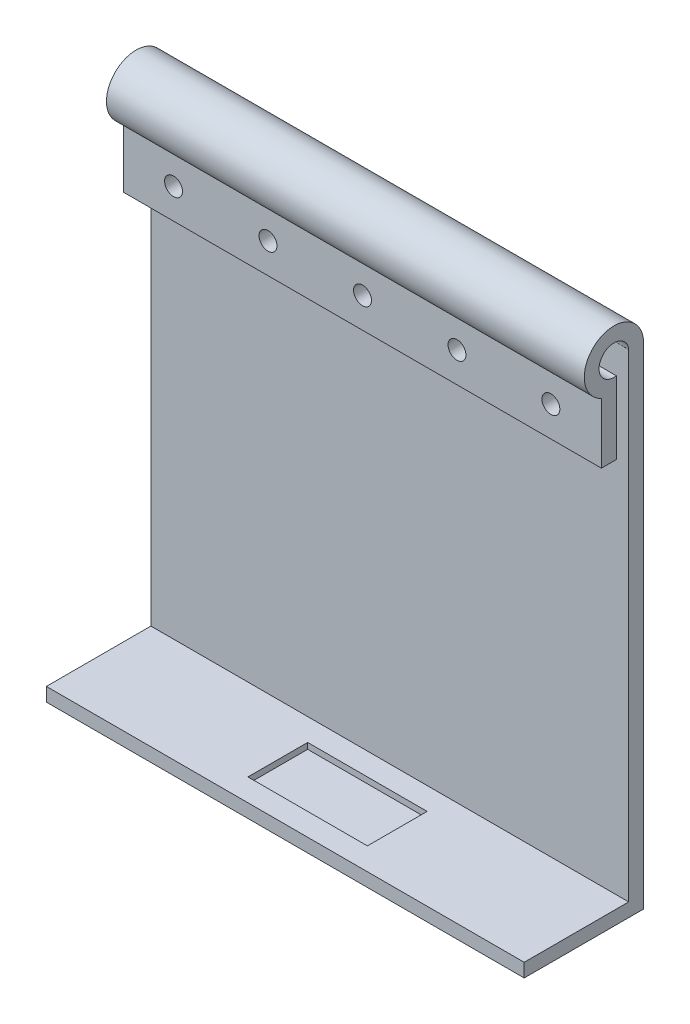
ISO-10303-21;
HEADER;
FILE_DESCRIPTION(('STEP AP214'),'2;1');
FILE_NAME('part.step','',(''),(''),'','','');
FILE_SCHEMA(('AUTOMOTIVE_DESIGN { 1 0 10303 214 1 1 1 1 }'));
ENDSEC;
DATA;
#1=APPLICATION_CONTEXT('core data for automotive mechanical design processes');
#2=APPLICATION_PROTOCOL_DEFINITION('international standard','automotive_design',2000,#1);
#3=PRODUCT_CONTEXT('',#1,'mechanical');
#4=PRODUCT('Part','Part','',(#3));
#5=PRODUCT_RELATED_PRODUCT_CATEGORY('part','',(#4));
#6=PRODUCT_DEFINITION_FORMATION('','',#4);
#7=PRODUCT_DEFINITION_CONTEXT('part definition',#1,'design');
#8=PRODUCT_DEFINITION('design','',#6,#7);
#9=PRODUCT_DEFINITION_SHAPE('','',#8);
#10=(LENGTH_UNIT() NAMED_UNIT(*) SI_UNIT(.MILLI.,.METRE.));
#11=(NAMED_UNIT(*) PLANE_ANGLE_UNIT() SI_UNIT($,.RADIAN.));
#12=(NAMED_UNIT(*) SI_UNIT($,.STERADIAN.) SOLID_ANGLE_UNIT());
#13=UNCERTAINTY_MEASURE_WITH_UNIT(LENGTH_MEASURE(1.E-05),#10,'distance_accuracy_value','');
#14=(GEOMETRIC_REPRESENTATION_CONTEXT(3) GLOBAL_UNCERTAINTY_ASSIGNED_CONTEXT((#13)) GLOBAL_UNIT_ASSIGNED_CONTEXT((#10,
#11,#12)) REPRESENTATION_CONTEXT('',''));
#15=CARTESIAN_POINT('',(0.,0.,0.));
#16=DIRECTION('',(0.,0.,1.));
#17=DIRECTION('',(1.,0.,0.));
#18=AXIS2_PLACEMENT_3D('',#15,#16,#17);
#19=CARTESIAN_POINT('',(0.,101.718969555035,3.175));
#20=DIRECTION('',(1.,0.,0.));
#21=DIRECTION('',(0.,0.,-1.));
#22=AXIS2_PLACEMENT_3D('',#19,#20,#21);
#23=PLANE('',#22);
#24=CARTESIAN_POINT('',(0.,101.334380732119,6.30719026611726));
#25=DIRECTION('',(1.,0.,0.));
#26=DIRECTION('',(0.,0.,-1.));
#27=AXIS2_PLACEMENT_3D('',#24,#25,#26);
#28=CIRCLE('',#27,3.175);
#29=CARTESIAN_POINT('',(0.,101.718969555035,3.15556902661396));
#30=VERTEX_POINT('',#29);
#31=CARTESIAN_POINT('',(0.,98.1999292876698,5.80138482685519));
#32=VERTEX_POINT('',#31);
#33=EDGE_CURVE('E345',#30,#32,#28,.T.);
#34=ORIENTED_EDGE('',*,*,#33,.T.);
#35=DIRECTION('',(0.,1.,0.));
#36=VECTOR('',#35,1.);
#37=CARTESIAN_POINT('',(0.,0.,5.80138482685519));
#38=LINE('',#37,#36);
#39=CARTESIAN_POINT('',(0.,82.7748742326806,5.80138482685519));
#40=VERTEX_POINT('',#39);
#41=EDGE_CURVE('E361',#40,#32,#38,.T.);
#42=ORIENTED_EDGE('',*,*,#41,.F.);
#43=DIRECTION('',(0.,0.,-1.));
#44=VECTOR('',#43,1.);
#45=CARTESIAN_POINT('',(0.,82.7748742326806,0.));
#46=LINE('',#45,#44);
#47=CARTESIAN_POINT('',(0.,82.7748742326806,8.97638482685518));
#48=VERTEX_POINT('',#47);
#49=EDGE_CURVE('E357',#48,#40,#46,.T.);
#50=ORIENTED_EDGE('',*,*,#49,.F.);
#51=DIRECTION('',(0.,-1.,0.));
#52=VECTOR('',#51,1.);
#53=CARTESIAN_POINT('',(0.,0.,8.97638482685518));
#54=LINE('',#53,#52);
#55=CARTESIAN_POINT('',(0.,95.6129273337618,8.97638482685518));
#56=VERTEX_POINT('',#55);
#57=EDGE_CURVE('E353',#56,#48,#54,.T.);
#58=ORIENTED_EDGE('',*,*,#57,.F.);
#59=CARTESIAN_POINT('',(0.,101.334380732119,6.30719026611726));
#60=DIRECTION('',(1.,0.,0.));
#61=DIRECTION('',(0.,0.,-1.));
#62=AXIS2_PLACEMENT_3D('',#59,#60,#61);
#63=CIRCLE('',#62,6.313448233149);
#64=CARTESIAN_POINT('',(0.,101.718969555035,0.00546668998822365));
#65=VERTEX_POINT('',#64);
#66=EDGE_CURVE('E349',#65,#56,#63,.T.);
#67=ORIENTED_EDGE('',*,*,#66,.F.);
#68=DIRECTION('',(0.,0.,-1.));
#69=VECTOR('',#68,1.);
#70=CARTESIAN_POINT('',(0.,101.718969555035,3.175));
#71=LINE('',#70,#69);
#72=CARTESIAN_POINT('',(0.,101.718969555035,0.));
#73=VERTEX_POINT('',#72);
#74=EDGE_CURVE('E446',#65,#73,#71,.T.);
#75=ORIENTED_EDGE('',*,*,#74,.T.);
#76=DIRECTION('',(0.,-1.,0.));
#77=VECTOR('',#76,1.);
#78=CARTESIAN_POINT('',(0.,101.718969555035,0.));
#79=LINE('',#78,#77);
#80=CARTESIAN_POINT('',(0.,101.615413718881,0.));
#81=VERTEX_POINT('',#80);
#82=EDGE_CURVE('E452',#73,#81,#79,.T.);
#83=ORIENTED_EDGE('',*,*,#82,.T.);
#84=CARTESIAN_POINT('',(0.,101.615413718881,0.));
#85=DIRECTION('',(0.,-1.,0.));
#86=VECTOR('',#85,1.);
#87=LINE('',#84,#86);
#88=CARTESIAN_POINT('',(0.,101.053347745358,0.));
#89=VERTEX_POINT('',#88);
#90=EDGE_CURVE('E457',#81,#89,#87,.T.);
#91=ORIENTED_EDGE('',*,*,#90,.T.);
#92=CARTESIAN_POINT('',(0.,-2.8971260585032,0.));
#93=VERTEX_POINT('',#92);
#94=EDGE_CURVE('E51',#89,#93,#79,.T.);
#95=ORIENTED_EDGE('',*,*,#94,.T.);
#96=DIRECTION('',(0.,0.,1.));
#97=VECTOR('',#96,1.);
#98=CARTESIAN_POINT('',(0.,-2.8971260585032,0.));
#99=LINE('',#98,#97);
#100=CARTESIAN_POINT('',(0.,-2.8971260585032,25.4));
#101=VERTEX_POINT('',#100);
#102=EDGE_CURVE('E244',#93,#101,#99,.T.);
#103=ORIENTED_EDGE('',*,*,#102,.T.);
#104=DIRECTION('',(0.,1.,0.));
#105=VECTOR('',#104,1.);
#106=CARTESIAN_POINT('',(0.,-2.8971260585032,25.4));
#107=LINE('',#106,#105);
#108=CARTESIAN_POINT('',(0.,0.,25.4));
#109=VERTEX_POINT('',#108);
#110=EDGE_CURVE('E232',#101,#109,#107,.T.);
#111=ORIENTED_EDGE('',*,*,#110,.T.);
#112=DIRECTION('',(0.,0.,-1.));
#113=VECTOR('',#112,1.);
#114=CARTESIAN_POINT('',(0.,0.,25.4));
#115=LINE('',#114,#113);
#116=CARTESIAN_POINT('',(0.,0.,3.175));
#117=VERTEX_POINT('',#116);
#118=EDGE_CURVE('E222',#109,#117,#115,.T.);
#119=ORIENTED_EDGE('',*,*,#118,.T.);
#120=DIRECTION('',(0.,-1.,0.));
#121=VECTOR('',#120,1.);
#122=CARTESIAN_POINT('',(0.,101.718969555035,3.175));
#123=LINE('',#122,#121);
#124=CARTESIAN_POINT('',(0.,101.718969555035,3.175));
#125=VERTEX_POINT('',#124);
#126=EDGE_CURVE('E427',#125,#117,#123,.T.);
#127=ORIENTED_EDGE('',*,*,#126,.F.);
#128=EDGE_CURVE('E524',#125,#30,#71,.T.);
#129=ORIENTED_EDGE('',*,*,#128,.T.);
#130=EDGE_LOOP('',(#34,#42,#50,#58,#67,#75,#83,#91,#95,#103,#111,#119,#127,#129));
#131=FACE_BOUND('',#130,.T.);
#132=ADVANCED_FACE('F47',(#131),#23,.F.);
#133=CARTESIAN_POINT('',(101.6,0.,3.175));
#134=DIRECTION('',(-1.,0.,0.));
#135=DIRECTION('',(0.,0.,1.));
#136=AXIS2_PLACEMENT_3D('',#133,#134,#135);
#137=PLANE('',#136);
#138=DIRECTION('',(0.,1.,0.));
#139=VECTOR('',#138,1.);
#140=CARTESIAN_POINT('',(101.6,0.,5.80138482685519));
#141=LINE('',#140,#139);
#142=CARTESIAN_POINT('',(101.6,82.7748742326806,5.80138482685519));
#143=VERTEX_POINT('',#142);
#144=CARTESIAN_POINT('',(101.6,98.1999292876698,5.80138482685519));
#145=VERTEX_POINT('',#144);
#146=EDGE_CURVE('E350',#143,#145,#141,.T.);
#147=ORIENTED_EDGE('',*,*,#146,.T.);
#148=CARTESIAN_POINT('',(101.6,101.334380732119,6.30719026611726));
#149=DIRECTION('',(1.,0.,0.));
#150=DIRECTION('',(0.,0.,-1.));
#151=AXIS2_PLACEMENT_3D('',#148,#149,#150);
#152=CIRCLE('',#151,3.175);
#153=CARTESIAN_POINT('',(101.6,101.718969555035,3.15556902661396));
#154=VERTEX_POINT('',#153);
#155=EDGE_CURVE('E344',#154,#145,#152,.T.);
#156=ORIENTED_EDGE('',*,*,#155,.F.);
#157=DIRECTION('',(0.,0.,-1.));
#158=VECTOR('',#157,1.);
#159=CARTESIAN_POINT('',(101.6,101.718969555035,3.175));
#160=LINE('',#159,#158);
#161=CARTESIAN_POINT('',(101.6,101.718969555035,3.175));
#162=VERTEX_POINT('',#161);
#163=EDGE_CURVE('E74',#162,#154,#160,.T.);
#164=ORIENTED_EDGE('',*,*,#163,.F.);
#165=DIRECTION('',(0.,1.,0.));
#166=VECTOR('',#165,1.);
#167=CARTESIAN_POINT('',(101.6,0.,3.175));
#168=LINE('',#167,#166);
#169=CARTESIAN_POINT('',(101.6,0.,3.175));
#170=VERTEX_POINT('',#169);
#171=EDGE_CURVE('E441',#170,#162,#168,.T.);
#172=ORIENTED_EDGE('',*,*,#171,.F.);
#173=DIRECTION('',(0.,0.,-1.));
#174=VECTOR('',#173,1.);
#175=CARTESIAN_POINT('',(101.6,0.,25.4));
#176=LINE('',#175,#174);
#177=CARTESIAN_POINT('',(101.6,0.,25.4));
#178=VERTEX_POINT('',#177);
#179=EDGE_CURVE('E228',#178,#170,#176,.T.);
#180=ORIENTED_EDGE('',*,*,#179,.F.);
#181=DIRECTION('',(0.,1.,0.));
#182=VECTOR('',#181,1.);
#183=CARTESIAN_POINT('',(101.6,-2.8971260585032,25.4));
#184=LINE('',#183,#182);
#185=CARTESIAN_POINT('',(101.6,-2.8971260585032,25.4));
#186=VERTEX_POINT('',#185);
#187=EDGE_CURVE('E236',#186,#178,#184,.T.);
#188=ORIENTED_EDGE('',*,*,#187,.F.);
#189=DIRECTION('',(0.,0.,1.));
#190=VECTOR('',#189,1.);
#191=CARTESIAN_POINT('',(101.6,-2.8971260585032,0.));
#192=LINE('',#191,#190);
#193=CARTESIAN_POINT('',(101.6,-2.8971260585032,0.));
#194=VERTEX_POINT('',#193);
#195=EDGE_CURVE('E231',#194,#186,#192,.T.);
#196=ORIENTED_EDGE('',*,*,#195,.F.);
#197=DIRECTION('',(0.,1.,0.));
#198=VECTOR('',#197,1.);
#199=CARTESIAN_POINT('',(101.6,0.,0.));
#200=LINE('',#199,#198);
#201=CARTESIAN_POINT('',(101.6,101.053347745358,0.));
#202=VERTEX_POINT('',#201);
#203=EDGE_CURVE('E476',#194,#202,#200,.T.);
#204=ORIENTED_EDGE('',*,*,#203,.T.);
#205=CARTESIAN_POINT('',(101.6,101.053347745358,0.));
#206=DIRECTION('',(0.,1.,0.));
#207=VECTOR('',#206,1.);
#208=LINE('',#205,#207);
#209=CARTESIAN_POINT('',(101.6,101.615413718881,0.));
#210=VERTEX_POINT('',#209);
#211=EDGE_CURVE('E400',#202,#210,#208,.T.);
#212=ORIENTED_EDGE('',*,*,#211,.T.);
#213=CARTESIAN_POINT('',(101.6,101.718969555035,0.));
#214=VERTEX_POINT('',#213);
#215=EDGE_CURVE('E456',#210,#214,#200,.T.);
#216=ORIENTED_EDGE('',*,*,#215,.T.);
#217=CARTESIAN_POINT('',(101.6,101.718969555035,0.00546668998822365));
#218=VERTEX_POINT('',#217);
#219=EDGE_CURVE('E544',#218,#214,#160,.T.);
#220=ORIENTED_EDGE('',*,*,#219,.F.);
#221=CARTESIAN_POINT('',(101.6,101.334380732119,6.30719026611726));
#222=DIRECTION('',(1.,0.,0.));
#223=DIRECTION('',(0.,0.,-1.));
#224=AXIS2_PLACEMENT_3D('',#221,#222,#223);
#225=CIRCLE('',#224,6.313448233149);
#226=CARTESIAN_POINT('',(101.6,95.6129273337618,8.97638482685518));
#227=VERTEX_POINT('',#226);
#228=EDGE_CURVE('E368',#218,#227,#225,.T.);
#229=ORIENTED_EDGE('',*,*,#228,.T.);
#230=DIRECTION('',(0.,-1.,0.));
#231=VECTOR('',#230,1.);
#232=CARTESIAN_POINT('',(101.6,0.,8.97638482685518));
#233=LINE('',#232,#231);
#234=CARTESIAN_POINT('',(101.6,82.7748742326806,8.97638482685518));
#235=VERTEX_POINT('',#234);
#236=EDGE_CURVE('E371',#227,#235,#233,.T.);
#237=ORIENTED_EDGE('',*,*,#236,.T.);
#238=DIRECTION('',(0.,0.,-1.));
#239=VECTOR('',#238,1.);
#240=CARTESIAN_POINT('',(101.6,82.7748742326806,0.));
#241=LINE('',#240,#239);
#242=EDGE_CURVE('E375',#235,#143,#241,.T.);
#243=ORIENTED_EDGE('',*,*,#242,.T.);
#244=EDGE_LOOP('',(#147,#156,#164,#172,#180,#188,#196,#204,#212,#216,#220,#229,#237,#243));
#245=FACE_BOUND('',#244,.T.);
#246=ADVANCED_FACE('F486',(#245),#137,.F.);
#247=CARTESIAN_POINT('',(0.,101.334380732119,6.30719026611726));
#248=DIRECTION('',(1.,0.,0.));
#249=DIRECTION('',(0.,0.,-1.));
#250=AXIS2_PLACEMENT_3D('',#247,#248,#249);
#251=CYLINDRICAL_SURFACE('',#250,3.175);
#252=DIRECTION('',(1.,0.,0.));
#253=VECTOR('',#252,1.);
#254=CARTESIAN_POINT('',(0.,98.1999292876698,5.80138482685519));
#255=LINE('',#254,#253);
#256=EDGE_CURVE('E340',#32,#145,#255,.T.);
#257=ORIENTED_EDGE('',*,*,#256,.F.);
#258=ORIENTED_EDGE('',*,*,#33,.F.);
#259=DIRECTION('',(1.,0.,0.));
#260=VECTOR('',#259,1.);
#261=CARTESIAN_POINT('',(0.,101.718969555035,3.15556902661396));
#262=LINE('',#261,#260);
#263=EDGE_CURVE('E394',#30,#154,#262,.T.);
#264=ORIENTED_EDGE('',*,*,#263,.T.);
#265=ORIENTED_EDGE('',*,*,#155,.T.);
#266=EDGE_LOOP('',(#257,#258,#264,#265));
#267=FACE_BOUND('',#266,.T.);
#268=ADVANCED_FACE('F421',(#267),#251,.F.);
#269=CARTESIAN_POINT('',(101.6,101.718969555035,3.175));
#270=DIRECTION('',(0.,-1.,0.));
#271=DIRECTION('',(0.,0.,-1.));
#272=AXIS2_PLACEMENT_3D('',#269,#270,#271);
#273=PLANE('',#272);
#274=ORIENTED_EDGE('',*,*,#263,.F.);
#275=ORIENTED_EDGE('',*,*,#128,.F.);
#276=DIRECTION('',(-1.,0.,0.));
#277=VECTOR('',#276,1.);
#278=CARTESIAN_POINT('',(101.6,101.718969555035,3.175));
#279=LINE('',#278,#277);
#280=EDGE_CURVE('E444',#162,#125,#279,.T.);
#281=ORIENTED_EDGE('',*,*,#280,.F.);
#282=ORIENTED_EDGE('',*,*,#163,.T.);
#283=EDGE_LOOP('',(#274,#275,#281,#282));
#284=FACE_BOUND('',#283,.T.);
#285=ADVANCED_FACE('F502',(#284),#273,.F.);
#286=CARTESIAN_POINT('',(0.,0.,0.));
#287=DIRECTION('',(0.,0.,1.));
#288=DIRECTION('',(1.,0.,0.));
#289=AXIS2_PLACEMENT_3D('',#286,#287,#288);
#290=PLANE('',#289);
#291=CARTESIAN_POINT('',(10.6180528519266,89.1939007832212,0.));
#292=DIRECTION('',(0.,0.,1.));
#293=DIRECTION('',(1.,0.,0.));
#294=AXIS2_PLACEMENT_3D('',#291,#292,#293);
#295=CIRCLE('',#294,1.905);
#296=CARTESIAN_POINT('',(12.5230528519266,89.1939007832212,0.));
#297=VERTEX_POINT('',#296);
#298=EDGE_CURVE('E336',#297,#297,#295,.T.);
#299=ORIENTED_EDGE('',*,*,#298,.T.);
#300=EDGE_LOOP('',(#299));
#301=FACE_BOUND('',#300,.T.);
#302=CARTESIAN_POINT('',(50.8,89.1939007832212,0.));
#303=DIRECTION('',(0.,0.,1.));
#304=DIRECTION('',(1.,0.,0.));
#305=AXIS2_PLACEMENT_3D('',#302,#303,#304);
#306=CIRCLE('',#305,1.905);
#307=CARTESIAN_POINT('',(52.705,89.1939007832212,0.));
#308=VERTEX_POINT('',#307);
#309=EDGE_CURVE('E324',#308,#308,#306,.T.);
#310=ORIENTED_EDGE('',*,*,#309,.T.);
#311=EDGE_LOOP('',(#310));
#312=FACE_BOUND('',#311,.T.);
#313=CARTESIAN_POINT('',(90.8563696876377,89.1939007832212,0.));
#314=DIRECTION('',(0.,0.,1.));
#315=DIRECTION('',(1.,0.,0.));
#316=AXIS2_PLACEMENT_3D('',#313,#314,#315);
#317=CIRCLE('',#316,1.90500000000001);
#318=CARTESIAN_POINT('',(92.7613696876377,89.1939007832212,0.));
#319=VERTEX_POINT('',#318);
#320=EDGE_CURVE('E312',#319,#319,#317,.T.);
#321=ORIENTED_EDGE('',*,*,#320,.T.);
#322=EDGE_LOOP('',(#321));
#323=FACE_BOUND('',#322,.T.);
#324=CARTESIAN_POINT('',(70.8909735740367,89.1939007832212,0.));
#325=DIRECTION('',(0.,0.,1.));
#326=DIRECTION('',(1.,0.,0.));
#327=AXIS2_PLACEMENT_3D('',#324,#325,#326);
#328=CIRCLE('',#327,1.90500000000001);
#329=CARTESIAN_POINT('',(72.7959735740367,89.1939007832212,0.));
#330=VERTEX_POINT('',#329);
#331=EDGE_CURVE('E300',#330,#330,#328,.T.);
#332=ORIENTED_EDGE('',*,*,#331,.T.);
#333=EDGE_LOOP('',(#332));
#334=FACE_BOUND('',#333,.T.);
#335=CARTESIAN_POINT('',(30.7090264259633,89.1939007832212,0.));
#336=DIRECTION('',(0.,0.,1.));
#337=DIRECTION('',(1.,0.,0.));
#338=AXIS2_PLACEMENT_3D('',#335,#336,#337);
#339=CIRCLE('',#338,1.905);
#340=CARTESIAN_POINT('',(32.6140264259633,89.1939007832212,0.));
#341=VERTEX_POINT('',#340);
#342=EDGE_CURVE('E288',#341,#341,#339,.T.);
#343=ORIENTED_EDGE('',*,*,#342,.T.);
#344=EDGE_LOOP('',(#343));
#345=FACE_BOUND('',#344,.T.);
#346=ORIENTED_EDGE('',*,*,#94,.F.);
#347=DIRECTION('',(1.,0.,0.));
#348=VECTOR('',#347,1.);
#349=CARTESIAN_POINT('',(0.,101.053347745358,0.));
#350=LINE('',#349,#348);
#351=EDGE_CURVE('E11',#89,#202,#350,.T.);
#352=ORIENTED_EDGE('',*,*,#351,.T.);
#353=ORIENTED_EDGE('',*,*,#203,.F.);
#354=DIRECTION('',(-1.,0.,0.));
#355=VECTOR('',#354,1.);
#356=CARTESIAN_POINT('',(101.6,-2.8971260585032,0.));
#357=LINE('',#356,#355);
#358=EDGE_CURVE('E240',#194,#93,#357,.T.);
#359=ORIENTED_EDGE('',*,*,#358,.T.);
#360=EDGE_LOOP('',(#346,#352,#353,#359));
#361=FACE_BOUND('',#360,.T.);
#362=ADVANCED_FACE('F500',(#301,#312,#323,#334,#345,#361),#290,.F.);
#363=ORIENTED_EDGE('',*,*,#74,.F.);
#364=DIRECTION('',(1.,0.,0.));
#365=VECTOR('',#364,1.);
#366=CARTESIAN_POINT('',(0.,101.718969555035,0.00546668998822365));
#367=LINE('',#366,#365);
#368=EDGE_CURVE('E384',#65,#218,#367,.T.);
#369=ORIENTED_EDGE('',*,*,#368,.T.);
#370=ORIENTED_EDGE('',*,*,#219,.T.);
#371=DIRECTION('',(-1.,0.,0.));
#372=VECTOR('',#371,1.);
#373=CARTESIAN_POINT('',(101.6,101.718969555035,0.));
#374=LINE('',#373,#372);
#375=EDGE_CURVE('E437',#214,#73,#374,.T.);
#376=ORIENTED_EDGE('',*,*,#375,.T.);
#377=EDGE_LOOP('',(#363,#369,#370,#376));
#378=FACE_BOUND('',#377,.T.);
#379=ADVANCED_FACE('F496',(#378),#273,.F.);
#380=CARTESIAN_POINT('',(0.,0.,3.175));
#381=DIRECTION('',(0.,0.,1.));
#382=DIRECTION('',(1.,0.,0.));
#383=AXIS2_PLACEMENT_3D('',#380,#381,#382);
#384=PLANE('',#383);
#385=CARTESIAN_POINT('',(10.6180528519266,89.1939007832212,3.175));
#386=DIRECTION('',(0.,0.,1.));
#387=DIRECTION('',(1.,0.,0.));
#388=AXIS2_PLACEMENT_3D('',#385,#386,#387);
#389=CIRCLE('',#388,1.905);
#390=CARTESIAN_POINT('',(12.5230528519266,89.1939007832212,3.175));
#391=VERTEX_POINT('',#390);
#392=EDGE_CURVE('E332',#391,#391,#389,.T.);
#393=ORIENTED_EDGE('',*,*,#392,.F.);
#394=EDGE_LOOP('',(#393));
#395=FACE_BOUND('',#394,.T.);
#396=CARTESIAN_POINT('',(50.8,89.1939007832212,3.175));
#397=DIRECTION('',(0.,0.,1.));
#398=DIRECTION('',(1.,0.,0.));
#399=AXIS2_PLACEMENT_3D('',#396,#397,#398);
#400=CIRCLE('',#399,1.905);
#401=CARTESIAN_POINT('',(52.705,89.1939007832212,3.175));
#402=VERTEX_POINT('',#401);
#403=EDGE_CURVE('E320',#402,#402,#400,.T.);
#404=ORIENTED_EDGE('',*,*,#403,.F.);
#405=EDGE_LOOP('',(#404));
#406=FACE_BOUND('',#405,.T.);
#407=CARTESIAN_POINT('',(90.8563696876377,89.1939007832212,3.175));
#408=DIRECTION('',(0.,0.,1.));
#409=DIRECTION('',(1.,0.,0.));
#410=AXIS2_PLACEMENT_3D('',#407,#408,#409);
#411=CIRCLE('',#410,1.90500000000001);
#412=CARTESIAN_POINT('',(92.7613696876377,89.1939007832212,3.175));
#413=VERTEX_POINT('',#412);
#414=EDGE_CURVE('E308',#413,#413,#411,.T.);
#415=ORIENTED_EDGE('',*,*,#414,.F.);
#416=EDGE_LOOP('',(#415));
#417=FACE_BOUND('',#416,.T.);
#418=CARTESIAN_POINT('',(70.8909735740367,89.1939007832212,3.175));
#419=DIRECTION('',(0.,0.,1.));
#420=DIRECTION('',(1.,0.,0.));
#421=AXIS2_PLACEMENT_3D('',#418,#419,#420);
#422=CIRCLE('',#421,1.90500000000001);
#423=CARTESIAN_POINT('',(72.7959735740367,89.1939007832212,3.175));
#424=VERTEX_POINT('',#423);
#425=EDGE_CURVE('E296',#424,#424,#422,.T.);
#426=ORIENTED_EDGE('',*,*,#425,.F.);
#427=EDGE_LOOP('',(#426));
#428=FACE_BOUND('',#427,.T.);
#429=CARTESIAN_POINT('',(30.7090264259633,89.1939007832212,3.175));
#430=DIRECTION('',(0.,0.,1.));
#431=DIRECTION('',(1.,0.,0.));
#432=AXIS2_PLACEMENT_3D('',#429,#430,#431);
#433=CIRCLE('',#432,1.905);
#434=CARTESIAN_POINT('',(32.6140264259633,89.1939007832212,3.175));
#435=VERTEX_POINT('',#434);
#436=EDGE_CURVE('E284',#435,#435,#433,.T.);
#437=ORIENTED_EDGE('',*,*,#436,.F.);
#438=EDGE_LOOP('',(#437));
#439=FACE_BOUND('',#438,.T.);
#440=ORIENTED_EDGE('',*,*,#171,.T.);
#441=ORIENTED_EDGE('',*,*,#280,.T.);
#442=ORIENTED_EDGE('',*,*,#126,.T.);
#443=DIRECTION('',(1.,0.,0.));
#444=VECTOR('',#443,1.);
#445=CARTESIAN_POINT('',(0.,0.,3.175));
#446=LINE('',#445,#444);
#447=EDGE_CURVE('E436',#117,#170,#446,.T.);
#448=ORIENTED_EDGE('',*,*,#447,.T.);
#449=EDGE_LOOP('',(#440,#441,#442,#448));
#450=FACE_BOUND('',#449,.T.);
#451=ADVANCED_FACE('F499',(#395,#406,#417,#428,#439,#450),#384,.T.);
#452=ORIENTED_EDGE('',*,*,#215,.F.);
#453=DIRECTION('',(1.,0.,0.));
#454=VECTOR('',#453,1.);
#455=CARTESIAN_POINT('',(0.,101.615413718881,0.));
#456=LINE('',#455,#454);
#457=EDGE_CURVE('E58',#210,#81,#456,.F.);
#458=ORIENTED_EDGE('',*,*,#457,.T.);
#459=ORIENTED_EDGE('',*,*,#82,.F.);
#460=ORIENTED_EDGE('',*,*,#375,.F.);
#461=EDGE_LOOP('',(#452,#458,#459,#460));
#462=FACE_BOUND('',#461,.T.);
#463=ADVANCED_FACE('F503',(#462),#290,.F.);
#464=CARTESIAN_POINT('',(0.,101.334380732119,6.30719026611726));
#465=DIRECTION('',(1.,0.,0.));
#466=DIRECTION('',(0.,0.,-1.));
#467=AXIS2_PLACEMENT_3D('',#464,#465,#466);
#468=CYLINDRICAL_SURFACE('',#467,6.313448233149);
#469=ORIENTED_EDGE('',*,*,#351,.F.);
#470=ORIENTED_EDGE('',*,*,#90,.F.);
#471=ORIENTED_EDGE('',*,*,#457,.F.);
#472=ORIENTED_EDGE('',*,*,#211,.F.);
#473=EDGE_LOOP('',(#469,#470,#471,#472));
#474=FACE_BOUND('',#473,.T.);
#475=ADVANCED_FACE('F417',(#474),#468,.T.);
#476=ORIENTED_EDGE('',*,*,#368,.F.);
#477=ORIENTED_EDGE('',*,*,#66,.T.);
#478=DIRECTION('',(1.,0.,0.));
#479=VECTOR('',#478,1.);
#480=CARTESIAN_POINT('',(0.,95.6129273337618,8.97638482685518));
#481=LINE('',#480,#479);
#482=EDGE_CURVE('E364',#56,#227,#481,.T.);
#483=ORIENTED_EDGE('',*,*,#482,.T.);
#484=ORIENTED_EDGE('',*,*,#228,.F.);
#485=EDGE_LOOP('',(#476,#477,#483,#484));
#486=FACE_BOUND('',#485,.T.);
#487=ADVANCED_FACE('F406',(#486),#468,.T.);
#488=CARTESIAN_POINT('',(0.,0.,5.80138482685519));
#489=DIRECTION('',(0.,0.,-1.));
#490=DIRECTION('',(-1.,0.,0.));
#491=AXIS2_PLACEMENT_3D('',#488,#489,#490);
#492=PLANE('',#491);
#493=CARTESIAN_POINT('',(10.6180528519266,89.1939007832212,5.80138482685519));
#494=DIRECTION('',(0.,0.,-1.));
#495=DIRECTION('',(-1.,0.,0.));
#496=AXIS2_PLACEMENT_3D('',#493,#494,#495);
#497=CIRCLE('',#496,1.905);
#498=CARTESIAN_POINT('',(8.71305285192657,89.1939007832212,5.80138482685519));
#499=VERTEX_POINT('',#498);
#500=EDGE_CURVE('E328',#499,#499,#497,.T.);
#501=ORIENTED_EDGE('',*,*,#500,.F.);
#502=EDGE_LOOP('',(#501));
#503=FACE_BOUND('',#502,.T.);
#504=CARTESIAN_POINT('',(50.8,89.1939007832212,5.80138482685519));
#505=DIRECTION('',(0.,0.,-1.));
#506=DIRECTION('',(-1.,0.,0.));
#507=AXIS2_PLACEMENT_3D('',#504,#505,#506);
#508=CIRCLE('',#507,1.905);
#509=CARTESIAN_POINT('',(48.895,89.1939007832212,5.80138482685519));
#510=VERTEX_POINT('',#509);
#511=EDGE_CURVE('E316',#510,#510,#508,.T.);
#512=ORIENTED_EDGE('',*,*,#511,.F.);
#513=EDGE_LOOP('',(#512));
#514=FACE_BOUND('',#513,.T.);
#515=CARTESIAN_POINT('',(90.8563696876377,89.1939007832212,5.80138482685519));
#516=DIRECTION('',(0.,0.,-1.));
#517=DIRECTION('',(-1.,0.,0.));
#518=AXIS2_PLACEMENT_3D('',#515,#516,#517);
#519=CIRCLE('',#518,1.90500000000001);
#520=CARTESIAN_POINT('',(88.9513696876377,89.1939007832212,5.80138482685519));
#521=VERTEX_POINT('',#520);
#522=EDGE_CURVE('E304',#521,#521,#519,.T.);
#523=ORIENTED_EDGE('',*,*,#522,.F.);
#524=EDGE_LOOP('',(#523));
#525=FACE_BOUND('',#524,.T.);
#526=CARTESIAN_POINT('',(70.8909735740367,89.1939007832212,5.80138482685519));
#527=DIRECTION('',(0.,0.,-1.));
#528=DIRECTION('',(-1.,0.,0.));
#529=AXIS2_PLACEMENT_3D('',#526,#527,#528);
#530=CIRCLE('',#529,1.90500000000001);
#531=CARTESIAN_POINT('',(68.9859735740367,89.1939007832212,5.80138482685519));
#532=VERTEX_POINT('',#531);
#533=EDGE_CURVE('E292',#532,#532,#530,.T.);
#534=ORIENTED_EDGE('',*,*,#533,.F.);
#535=EDGE_LOOP('',(#534));
#536=FACE_BOUND('',#535,.T.);
#537=CARTESIAN_POINT('',(30.7090264259633,89.1939007832212,5.80138482685519));
#538=DIRECTION('',(0.,0.,-1.));
#539=DIRECTION('',(-1.,0.,0.));
#540=AXIS2_PLACEMENT_3D('',#537,#538,#539);
#541=CIRCLE('',#540,1.905);
#542=CARTESIAN_POINT('',(28.8040264259633,89.1939007832212,5.80138482685519));
#543=VERTEX_POINT('',#542);
#544=EDGE_CURVE('E265',#543,#543,#541,.T.);
#545=ORIENTED_EDGE('',*,*,#544,.F.);
#546=EDGE_LOOP('',(#545));
#547=FACE_BOUND('',#546,.T.);
#548=ORIENTED_EDGE('',*,*,#146,.F.);
#549=DIRECTION('',(1.,0.,0.));
#550=VECTOR('',#549,1.);
#551=CARTESIAN_POINT('',(0.,82.7748742326806,5.80138482685519));
#552=LINE('',#551,#550);
#553=EDGE_CURVE('E381',#40,#143,#552,.T.);
#554=ORIENTED_EDGE('',*,*,#553,.F.);
#555=ORIENTED_EDGE('',*,*,#41,.T.);
#556=ORIENTED_EDGE('',*,*,#256,.T.);
#557=EDGE_LOOP('',(#548,#554,#555,#556));
#558=FACE_BOUND('',#557,.T.);
#559=ADVANCED_FACE('F416',(#503,#514,#525,#536,#547,#558),#492,.T.);
#560=CARTESIAN_POINT('',(0.,82.7748742326806,0.));
#561=DIRECTION('',(0.,-1.,0.));
#562=DIRECTION('',(0.,0.,-1.));
#563=AXIS2_PLACEMENT_3D('',#560,#561,#562);
#564=PLANE('',#563);
#565=ORIENTED_EDGE('',*,*,#242,.F.);
#566=DIRECTION('',(1.,0.,0.));
#567=VECTOR('',#566,1.);
#568=CARTESIAN_POINT('',(0.,82.7748742326806,8.97638482685518));
#569=LINE('',#568,#567);
#570=EDGE_CURVE('E385',#48,#235,#569,.T.);
#571=ORIENTED_EDGE('',*,*,#570,.F.);
#572=ORIENTED_EDGE('',*,*,#49,.T.);
#573=ORIENTED_EDGE('',*,*,#553,.T.);
#574=EDGE_LOOP('',(#565,#571,#572,#573));
#575=FACE_BOUND('',#574,.T.);
#576=ADVANCED_FACE('F532',(#575),#564,.T.);
#577=CARTESIAN_POINT('',(0.,0.,8.97638482685518));
#578=DIRECTION('',(0.,0.,1.));
#579=DIRECTION('',(1.,0.,0.));
#580=AXIS2_PLACEMENT_3D('',#577,#578,#579);
#581=PLANE('',#580);
#582=CARTESIAN_POINT('',(10.6180528519266,89.1939007832212,8.97638482685518));
#583=DIRECTION('',(0.,0.,1.));
#584=DIRECTION('',(1.,0.,0.));
#585=AXIS2_PLACEMENT_3D('',#582,#583,#584);
#586=CIRCLE('',#585,1.905);
#587=CARTESIAN_POINT('',(12.5230528519266,89.1939007832212,8.97638482685518));
#588=VERTEX_POINT('',#587);
#589=EDGE_CURVE('E261',#588,#588,#586,.T.);
#590=ORIENTED_EDGE('',*,*,#589,.F.);
#591=EDGE_LOOP('',(#590));
#592=FACE_BOUND('',#591,.T.);
#593=CARTESIAN_POINT('',(50.8,89.1939007832212,8.97638482685518));
#594=DIRECTION('',(0.,0.,1.));
#595=DIRECTION('',(1.,0.,0.));
#596=AXIS2_PLACEMENT_3D('',#593,#594,#595);
#597=CIRCLE('',#596,1.905);
#598=CARTESIAN_POINT('',(52.705,89.1939007832212,8.97638482685518));
#599=VERTEX_POINT('',#598);
#600=EDGE_CURVE('E254',#599,#599,#597,.T.);
#601=ORIENTED_EDGE('',*,*,#600,.F.);
#602=EDGE_LOOP('',(#601));
#603=FACE_BOUND('',#602,.T.);
#604=CARTESIAN_POINT('',(90.8563696876377,89.1939007832212,8.97638482685518));
#605=DIRECTION('',(0.,0.,1.));
#606=DIRECTION('',(1.,0.,0.));
#607=AXIS2_PLACEMENT_3D('',#604,#605,#606);
#608=CIRCLE('',#607,1.90500000000001);
#609=CARTESIAN_POINT('',(92.7613696876377,89.1939007832212,8.97638482685518));
#610=VERTEX_POINT('',#609);
#611=EDGE_CURVE('E267',#610,#610,#608,.T.);
#612=ORIENTED_EDGE('',*,*,#611,.F.);
#613=EDGE_LOOP('',(#612));
#614=FACE_BOUND('',#613,.T.);
#615=CARTESIAN_POINT('',(70.8909735740367,89.1939007832212,8.97638482685518));
#616=DIRECTION('',(0.,0.,1.));
#617=DIRECTION('',(1.,0.,0.));
#618=AXIS2_PLACEMENT_3D('',#615,#616,#617);
#619=CIRCLE('',#618,1.90500000000001);
#620=CARTESIAN_POINT('',(72.7959735740367,89.1939007832212,8.97638482685518));
#621=VERTEX_POINT('',#620);
#622=EDGE_CURVE('E271',#621,#621,#619,.T.);
#623=ORIENTED_EDGE('',*,*,#622,.F.);
#624=EDGE_LOOP('',(#623));
#625=FACE_BOUND('',#624,.T.);
#626=CARTESIAN_POINT('',(30.7090264259633,89.1939007832212,8.97638482685518));
#627=DIRECTION('',(0.,0.,1.));
#628=DIRECTION('',(1.,0.,0.));
#629=AXIS2_PLACEMENT_3D('',#626,#627,#628);
#630=CIRCLE('',#629,1.905);
#631=CARTESIAN_POINT('',(32.6140264259633,89.1939007832212,8.97638482685518));
#632=VERTEX_POINT('',#631);
#633=EDGE_CURVE('E266',#632,#632,#630,.T.);
#634=ORIENTED_EDGE('',*,*,#633,.F.);
#635=EDGE_LOOP('',(#634));
#636=FACE_BOUND('',#635,.T.);
#637=ORIENTED_EDGE('',*,*,#236,.F.);
#638=ORIENTED_EDGE('',*,*,#482,.F.);
#639=ORIENTED_EDGE('',*,*,#57,.T.);
#640=ORIENTED_EDGE('',*,*,#570,.T.);
#641=EDGE_LOOP('',(#637,#638,#639,#640));
#642=FACE_BOUND('',#641,.T.);
#643=ADVANCED_FACE('F419',(#592,#603,#614,#625,#636,#642),#581,.T.);
#644=CARTESIAN_POINT('',(30.7090264259633,89.1939007832212,-1.81861517314481));
#645=DIRECTION('',(0.,0.,1.));
#646=DIRECTION('',(1.,0.,0.));
#647=AXIS2_PLACEMENT_3D('',#644,#645,#646);
#648=CYLINDRICAL_SURFACE('',#647,1.905);
#649=ORIENTED_EDGE('',*,*,#544,.T.);
#650=EDGE_LOOP('',(#649));
#651=FACE_BOUND('',#650,.T.);
#652=ORIENTED_EDGE('',*,*,#633,.T.);
#653=EDGE_LOOP('',(#652));
#654=FACE_BOUND('',#653,.T.);
#655=ADVANCED_FACE('F600',(#651,#654),#648,.F.);
#656=CARTESIAN_POINT('',(70.8909735740367,89.1939007832212,-1.81861517314481));
#657=DIRECTION('',(0.,0.,1.));
#658=DIRECTION('',(1.,0.,0.));
#659=AXIS2_PLACEMENT_3D('',#656,#657,#658);
#660=CYLINDRICAL_SURFACE('',#659,1.90500000000001);
#661=ORIENTED_EDGE('',*,*,#533,.T.);
#662=EDGE_LOOP('',(#661));
#663=FACE_BOUND('',#662,.T.);
#664=ORIENTED_EDGE('',*,*,#622,.T.);
#665=EDGE_LOOP('',(#664));
#666=FACE_BOUND('',#665,.T.);
#667=ADVANCED_FACE('F594',(#663,#666),#660,.F.);
#668=CARTESIAN_POINT('',(90.8563696876377,89.1939007832212,-1.81861517314481));
#669=DIRECTION('',(0.,0.,1.));
#670=DIRECTION('',(1.,0.,0.));
#671=AXIS2_PLACEMENT_3D('',#668,#669,#670);
#672=CYLINDRICAL_SURFACE('',#671,1.90500000000001);
#673=ORIENTED_EDGE('',*,*,#522,.T.);
#674=EDGE_LOOP('',(#673));
#675=FACE_BOUND('',#674,.T.);
#676=ORIENTED_EDGE('',*,*,#611,.T.);
#677=EDGE_LOOP('',(#676));
#678=FACE_BOUND('',#677,.T.);
#679=ADVANCED_FACE('F591',(#675,#678),#672,.F.);
#680=CARTESIAN_POINT('',(50.8,89.1939007832212,-1.81861517314481));
#681=DIRECTION('',(0.,0.,1.));
#682=DIRECTION('',(1.,0.,0.));
#683=AXIS2_PLACEMENT_3D('',#680,#681,#682);
#684=CYLINDRICAL_SURFACE('',#683,1.905);
#685=ORIENTED_EDGE('',*,*,#511,.T.);
#686=EDGE_LOOP('',(#685));
#687=FACE_BOUND('',#686,.T.);
#688=ORIENTED_EDGE('',*,*,#600,.T.);
#689=EDGE_LOOP('',(#688));
#690=FACE_BOUND('',#689,.T.);
#691=ADVANCED_FACE('F589',(#687,#690),#684,.F.);
#692=CARTESIAN_POINT('',(10.6180528519266,89.1939007832212,-1.81861517314481));
#693=DIRECTION('',(0.,0.,1.));
#694=DIRECTION('',(1.,0.,0.));
#695=AXIS2_PLACEMENT_3D('',#692,#693,#694);
#696=CYLINDRICAL_SURFACE('',#695,1.905);
#697=ORIENTED_EDGE('',*,*,#500,.T.);
#698=EDGE_LOOP('',(#697));
#699=FACE_BOUND('',#698,.T.);
#700=ORIENTED_EDGE('',*,*,#589,.T.);
#701=EDGE_LOOP('',(#700));
#702=FACE_BOUND('',#701,.T.);
#703=ADVANCED_FACE('F584',(#699,#702),#696,.F.);
#704=ORIENTED_EDGE('',*,*,#436,.T.);
#705=EDGE_LOOP('',(#704));
#706=FACE_BOUND('',#705,.T.);
#707=ORIENTED_EDGE('',*,*,#342,.F.);
#708=EDGE_LOOP('',(#707));
#709=FACE_BOUND('',#708,.T.);
#710=ADVANCED_FACE('F588',(#706,#709),#648,.F.);
#711=ORIENTED_EDGE('',*,*,#425,.T.);
#712=EDGE_LOOP('',(#711));
#713=FACE_BOUND('',#712,.T.);
#714=ORIENTED_EDGE('',*,*,#331,.F.);
#715=EDGE_LOOP('',(#714));
#716=FACE_BOUND('',#715,.T.);
#717=ADVANCED_FACE('F607',(#713,#716),#660,.F.);
#718=ORIENTED_EDGE('',*,*,#414,.T.);
#719=EDGE_LOOP('',(#718));
#720=FACE_BOUND('',#719,.T.);
#721=ORIENTED_EDGE('',*,*,#320,.F.);
#722=EDGE_LOOP('',(#721));
#723=FACE_BOUND('',#722,.T.);
#724=ADVANCED_FACE('F596',(#720,#723),#672,.F.);
#725=ORIENTED_EDGE('',*,*,#403,.T.);
#726=EDGE_LOOP('',(#725));
#727=FACE_BOUND('',#726,.T.);
#728=ORIENTED_EDGE('',*,*,#309,.F.);
#729=EDGE_LOOP('',(#728));
#730=FACE_BOUND('',#729,.T.);
#731=ADVANCED_FACE('F581',(#727,#730),#684,.F.);
#732=ORIENTED_EDGE('',*,*,#392,.T.);
#733=EDGE_LOOP('',(#732));
#734=FACE_BOUND('',#733,.T.);
#735=ORIENTED_EDGE('',*,*,#298,.F.);
#736=EDGE_LOOP('',(#735));
#737=FACE_BOUND('',#736,.T.);
#738=ADVANCED_FACE('F573',(#734,#737),#696,.F.);
#739=CARTESIAN_POINT('',(101.6,0.,25.4));
#740=DIRECTION('',(0.,1.,0.));
#741=DIRECTION('',(0.,0.,1.));
#742=AXIS2_PLACEMENT_3D('',#739,#740,#741);
#743=PLANE('',#742);
#744=DIRECTION('',(0.,0.,1.));
#745=VECTOR('',#744,1.);
#746=CARTESIAN_POINT('',(38.1,0.,20.6375));
#747=LINE('',#746,#745);
#748=CARTESIAN_POINT('',(38.1,0.,7.93750000000001));
#749=VERTEX_POINT('',#748);
#750=CARTESIAN_POINT('',(38.1,0.,20.6375));
#751=VERTEX_POINT('',#750);
#752=EDGE_CURVE('E66',#749,#751,#747,.T.);
#753=ORIENTED_EDGE('',*,*,#752,.F.);
#754=DIRECTION('',(-1.,0.,0.));
#755=VECTOR('',#754,1.);
#756=CARTESIAN_POINT('',(63.5,0.,7.9375));
#757=LINE('',#756,#755);
#758=CARTESIAN_POINT('',(63.5,0.,7.9375));
#759=VERTEX_POINT('',#758);
#760=EDGE_CURVE('E200',#759,#749,#757,.T.);
#761=ORIENTED_EDGE('',*,*,#760,.F.);
#762=DIRECTION('',(0.,0.,-1.));
#763=VECTOR('',#762,1.);
#764=CARTESIAN_POINT('',(63.5,0.,20.6375));
#765=LINE('',#764,#763);
#766=CARTESIAN_POINT('',(63.5,0.,20.6375));
#767=VERTEX_POINT('',#766);
#768=EDGE_CURVE('E204',#767,#759,#765,.T.);
#769=ORIENTED_EDGE('',*,*,#768,.F.);
#770=DIRECTION('',(1.,0.,0.));
#771=VECTOR('',#770,1.);
#772=CARTESIAN_POINT('',(63.5,0.,20.6375));
#773=LINE('',#772,#771);
#774=EDGE_CURVE('E213',#751,#767,#773,.T.);
#775=ORIENTED_EDGE('',*,*,#774,.F.);
#776=EDGE_LOOP('',(#753,#761,#769,#775));
#777=FACE_BOUND('',#776,.T.);
#778=ORIENTED_EDGE('',*,*,#447,.F.);
#779=ORIENTED_EDGE('',*,*,#118,.F.);
#780=DIRECTION('',(-1.,0.,0.));
#781=VECTOR('',#780,1.);
#782=CARTESIAN_POINT('',(101.6,0.,25.4));
#783=LINE('',#782,#781);
#784=EDGE_CURVE('E251',#178,#109,#783,.T.);
#785=ORIENTED_EDGE('',*,*,#784,.F.);
#786=ORIENTED_EDGE('',*,*,#179,.T.);
#787=EDGE_LOOP('',(#778,#779,#785,#786));
#788=FACE_BOUND('',#787,.T.);
#789=ADVANCED_FACE('F571',(#777,#788),#743,.T.);
#790=CARTESIAN_POINT('',(101.6,-2.8971260585032,25.4));
#791=DIRECTION('',(0.,0.,1.));
#792=DIRECTION('',(1.,0.,0.));
#793=AXIS2_PLACEMENT_3D('',#790,#791,#792);
#794=PLANE('',#793);
#795=ORIENTED_EDGE('',*,*,#110,.F.);
#796=DIRECTION('',(-1.,0.,0.));
#797=VECTOR('',#796,1.);
#798=CARTESIAN_POINT('',(101.6,-2.8971260585032,25.4));
#799=LINE('',#798,#797);
#800=EDGE_CURVE('E255',#186,#101,#799,.T.);
#801=ORIENTED_EDGE('',*,*,#800,.F.);
#802=ORIENTED_EDGE('',*,*,#187,.T.);
#803=ORIENTED_EDGE('',*,*,#784,.T.);
#804=EDGE_LOOP('',(#795,#801,#802,#803));
#805=FACE_BOUND('',#804,.T.);
#806=ADVANCED_FACE('F560',(#805),#794,.T.);
#807=CARTESIAN_POINT('',(101.6,-2.8971260585032,0.));
#808=DIRECTION('',(0.,-1.,0.));
#809=DIRECTION('',(0.,0.,-1.));
#810=AXIS2_PLACEMENT_3D('',#807,#808,#809);
#811=PLANE('',#810);
#812=ORIENTED_EDGE('',*,*,#102,.F.);
#813=ORIENTED_EDGE('',*,*,#358,.F.);
#814=ORIENTED_EDGE('',*,*,#195,.T.);
#815=ORIENTED_EDGE('',*,*,#800,.T.);
#816=EDGE_LOOP('',(#812,#813,#814,#815));
#817=FACE_BOUND('',#816,.T.);
#818=ADVANCED_FACE('F557',(#817),#811,.T.);
#819=CARTESIAN_POINT('',(38.1,-1.27,20.6375));
#820=DIRECTION('',(-1.,0.,0.));
#821=DIRECTION('',(0.,0.,1.));
#822=AXIS2_PLACEMENT_3D('',#819,#820,#821);
#823=PLANE('',#822);
#824=ORIENTED_EDGE('',*,*,#752,.T.);
#825=DIRECTION('',(0.,1.,0.));
#826=VECTOR('',#825,1.);
#827=CARTESIAN_POINT('',(38.1,-1.27,20.6375));
#828=LINE('',#827,#826);
#829=CARTESIAN_POINT('',(38.1,-1.27,20.6375));
#830=VERTEX_POINT('',#829);
#831=EDGE_CURVE('E175',#830,#751,#828,.T.);
#832=ORIENTED_EDGE('',*,*,#831,.F.);
#833=DIRECTION('',(0.,0.,1.));
#834=VECTOR('',#833,1.);
#835=CARTESIAN_POINT('',(38.1,-1.27,20.6375));
#836=LINE('',#835,#834);
#837=CARTESIAN_POINT('',(38.1,-1.27,7.93750000000001));
#838=VERTEX_POINT('',#837);
#839=EDGE_CURVE('E179',#838,#830,#836,.T.);
#840=ORIENTED_EDGE('',*,*,#839,.F.);
#841=DIRECTION('',(0.,1.,0.));
#842=VECTOR('',#841,1.);
#843=CARTESIAN_POINT('',(38.1,-1.27,7.93750000000001));
#844=LINE('',#843,#842);
#845=EDGE_CURVE('E219',#838,#749,#844,.T.);
#846=ORIENTED_EDGE('',*,*,#845,.T.);
#847=EDGE_LOOP('',(#824,#832,#840,#846));
#848=FACE_BOUND('',#847,.T.);
#849=ADVANCED_FACE('F177',(#848),#823,.F.);
#850=CARTESIAN_POINT('',(63.5,-1.27,7.9375));
#851=DIRECTION('',(0.,0.,-1.));
#852=DIRECTION('',(-1.,0.,0.));
#853=AXIS2_PLACEMENT_3D('',#850,#851,#852);
#854=PLANE('',#853);
#855=ORIENTED_EDGE('',*,*,#760,.T.);
#856=ORIENTED_EDGE('',*,*,#845,.F.);
#857=DIRECTION('',(-1.,0.,0.));
#858=VECTOR('',#857,1.);
#859=CARTESIAN_POINT('',(63.5,-1.27,7.9375));
#860=LINE('',#859,#858);
#861=CARTESIAN_POINT('',(63.5,-1.27,7.9375));
#862=VERTEX_POINT('',#861);
#863=EDGE_CURVE('E186',#862,#838,#860,.T.);
#864=ORIENTED_EDGE('',*,*,#863,.F.);
#865=DIRECTION('',(0.,1.,0.));
#866=VECTOR('',#865,1.);
#867=CARTESIAN_POINT('',(63.5,-1.27,7.9375));
#868=LINE('',#867,#866);
#869=EDGE_CURVE('E223',#862,#759,#868,.T.);
#870=ORIENTED_EDGE('',*,*,#869,.T.);
#871=EDGE_LOOP('',(#855,#856,#864,#870));
#872=FACE_BOUND('',#871,.T.);
#873=ADVANCED_FACE('F741',(#872),#854,.F.);
#874=CARTESIAN_POINT('',(63.5,-1.27,20.6375));
#875=DIRECTION('',(1.,0.,0.));
#876=DIRECTION('',(0.,0.,-1.));
#877=AXIS2_PLACEMENT_3D('',#874,#875,#876);
#878=PLANE('',#877);
#879=ORIENTED_EDGE('',*,*,#768,.T.);
#880=ORIENTED_EDGE('',*,*,#869,.F.);
#881=DIRECTION('',(0.,0.,-1.));
#882=VECTOR('',#881,1.);
#883=CARTESIAN_POINT('',(63.5,-1.27,20.6375));
#884=LINE('',#883,#882);
#885=CARTESIAN_POINT('',(63.5,-1.27,20.6375));
#886=VERTEX_POINT('',#885);
#887=EDGE_CURVE('E195',#886,#862,#884,.T.);
#888=ORIENTED_EDGE('',*,*,#887,.F.);
#889=DIRECTION('',(0.,1.,0.));
#890=VECTOR('',#889,1.);
#891=CARTESIAN_POINT('',(63.5,-1.27,20.6375));
#892=LINE('',#891,#890);
#893=EDGE_CURVE('E185',#886,#767,#892,.T.);
#894=ORIENTED_EDGE('',*,*,#893,.T.);
#895=EDGE_LOOP('',(#879,#880,#888,#894));
#896=FACE_BOUND('',#895,.T.);
#897=ADVANCED_FACE('F750',(#896),#878,.F.);
#898=CARTESIAN_POINT('',(63.5,-1.27,20.6375));
#899=DIRECTION('',(0.,0.,1.));
#900=DIRECTION('',(0.,-1.,0.));
#901=AXIS2_PLACEMENT_3D('',#898,#899,#900);
#902=PLANE('',#901);
#903=ORIENTED_EDGE('',*,*,#774,.T.);
#904=ORIENTED_EDGE('',*,*,#893,.F.);
#905=DIRECTION('',(1.,0.,0.));
#906=VECTOR('',#905,1.);
#907=CARTESIAN_POINT('',(63.5,-1.27,20.6375));
#908=LINE('',#907,#906);
#909=EDGE_CURVE('E189',#830,#886,#908,.T.);
#910=ORIENTED_EDGE('',*,*,#909,.F.);
#911=ORIENTED_EDGE('',*,*,#831,.T.);
#912=EDGE_LOOP('',(#903,#904,#910,#911));
#913=FACE_BOUND('',#912,.T.);
#914=ADVANCED_FACE('F190',(#913),#902,.F.);
#915=CARTESIAN_POINT('',(0.,-1.27,0.));
#916=DIRECTION('',(0.,1.,0.));
#917=DIRECTION('',(0.,0.,1.));
#918=AXIS2_PLACEMENT_3D('',#915,#916,#917);
#919=PLANE('',#918);
#920=ORIENTED_EDGE('',*,*,#839,.T.);
#921=ORIENTED_EDGE('',*,*,#909,.T.);
#922=ORIENTED_EDGE('',*,*,#887,.T.);
#923=ORIENTED_EDGE('',*,*,#863,.T.);
#924=EDGE_LOOP('',(#920,#921,#922,#923));
#925=FACE_BOUND('',#924,.T.);
#926=ADVANCED_FACE('F197',(#925),#919,.T.);
#927=CLOSED_SHELL('',(#132,#246,#268,#285,#362,#379,#451,#463,#475,#487,#559,#576,#643,#655,
#667,#679,#691,#703,#710,#717,#724,#731,#738,#789,#806,#818,#849,#873,#897,#914,#926));
#928=MANIFOLD_SOLID_BREP('B2',#927);
#929=ADVANCED_BREP_SHAPE_REPRESENTATION('',(#18,#928),#14);
#930=SHAPE_DEFINITION_REPRESENTATION(#9,#929);
ENDSEC;
END-ISO-10303-21;
